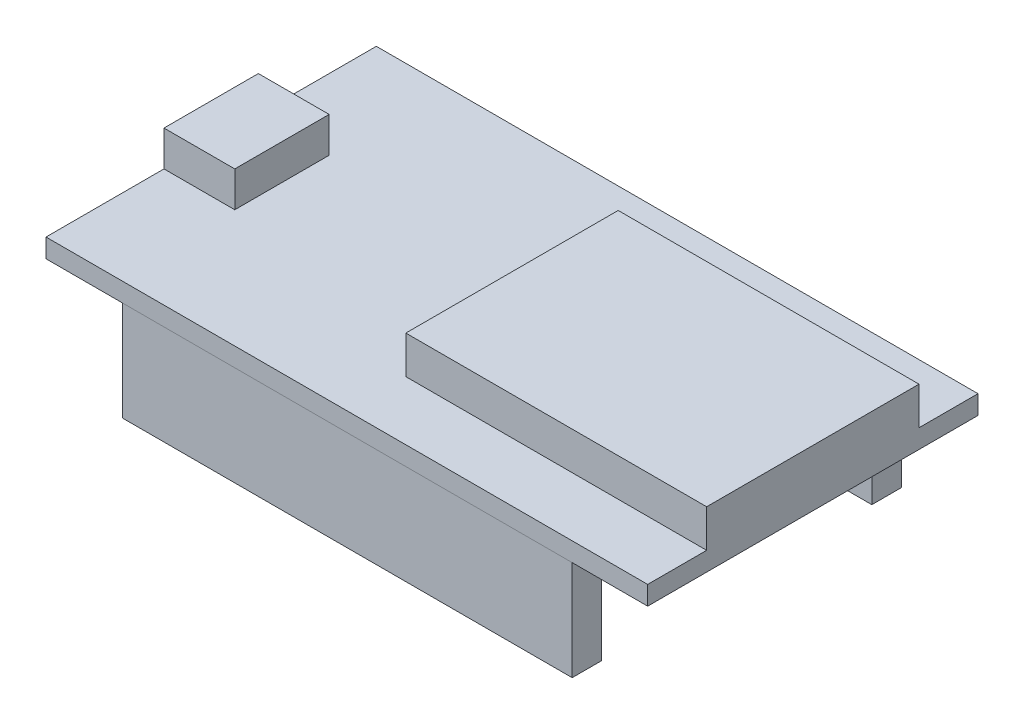
ISO-10303-21;
HEADER;
FILE_DESCRIPTION(('STEP AP214'),'2;1');
FILE_NAME('part.step','',(''),(''),'','','');
FILE_SCHEMA(('AUTOMOTIVE_DESIGN { 1 0 10303 214 1 1 1 1 }'));
ENDSEC;
DATA;
#1=APPLICATION_CONTEXT('core data for automotive mechanical design processes');
#2=APPLICATION_PROTOCOL_DEFINITION('international standard','automotive_design',2000,#1);
#3=PRODUCT_CONTEXT('',#1,'mechanical');
#4=PRODUCT('Part','Part','',(#3));
#5=PRODUCT_RELATED_PRODUCT_CATEGORY('part','',(#4));
#6=PRODUCT_DEFINITION_FORMATION('','',#4);
#7=PRODUCT_DEFINITION_CONTEXT('part definition',#1,'design');
#8=PRODUCT_DEFINITION('design','',#6,#7);
#9=PRODUCT_DEFINITION_SHAPE('','',#8);
#10=(LENGTH_UNIT() NAMED_UNIT(*) SI_UNIT(.MILLI.,.METRE.));
#11=(NAMED_UNIT(*) PLANE_ANGLE_UNIT() SI_UNIT($,.RADIAN.));
#12=(NAMED_UNIT(*) SI_UNIT($,.STERADIAN.) SOLID_ANGLE_UNIT());
#13=UNCERTAINTY_MEASURE_WITH_UNIT(LENGTH_MEASURE(1.E-05),#10,'distance_accuracy_value','');
#14=(GEOMETRIC_REPRESENTATION_CONTEXT(3) GLOBAL_UNCERTAINTY_ASSIGNED_CONTEXT((#13)) GLOBAL_UNIT_ASSIGNED_CONTEXT((#10,
#11,#12)) REPRESENTATION_CONTEXT('',''));
#15=CARTESIAN_POINT('',(0.,0.,0.));
#16=DIRECTION('',(0.,0.,1.));
#17=DIRECTION('',(1.,0.,0.));
#18=AXIS2_PLACEMENT_3D('',#15,#16,#17);
#19=CARTESIAN_POINT('',(0.,0.,0.));
#20=DIRECTION('',(0.,-1.,0.));
#21=DIRECTION('',(0.,0.,-1.));
#22=AXIS2_PLACEMENT_3D('',#19,#20,#21);
#23=PLANE('',#22);
#24=DIRECTION('',(0.,0.,-1.));
#25=VECTOR('',#24,1.);
#26=CARTESIAN_POINT('',(25.5,0.,14.));
#27=LINE('',#26,#25);
#28=CARTESIAN_POINT('',(25.5,0.,14.));
#29=VERTEX_POINT('',#28);
#30=CARTESIAN_POINT('',(25.5,0.,-14.));
#31=VERTEX_POINT('',#30);
#32=EDGE_CURVE('E312',#29,#31,#27,.T.);
#33=ORIENTED_EDGE('',*,*,#32,.F.);
#34=DIRECTION('',(1.,0.,0.));
#35=VECTOR('',#34,1.);
#36=CARTESIAN_POINT('',(-25.5,0.,14.));
#37=LINE('',#36,#35);
#38=CARTESIAN_POINT('',(-25.5,0.,14.));
#39=VERTEX_POINT('',#38);
#40=EDGE_CURVE('E331',#39,#29,#37,.T.);
#41=ORIENTED_EDGE('',*,*,#40,.F.);
#42=DIRECTION('',(0.,0.,1.));
#43=VECTOR('',#42,1.);
#44=CARTESIAN_POINT('',(-25.5,0.,14.));
#45=LINE('',#44,#43);
#46=CARTESIAN_POINT('',(-25.5,0.,-14.));
#47=VERTEX_POINT('',#46);
#48=EDGE_CURVE('E327',#47,#39,#45,.T.);
#49=ORIENTED_EDGE('',*,*,#48,.F.);
#50=DIRECTION('',(-1.,0.,0.));
#51=VECTOR('',#50,1.);
#52=CARTESIAN_POINT('',(-25.5,0.,-14.));
#53=LINE('',#52,#51);
#54=EDGE_CURVE('E330',#31,#47,#53,.T.);
#55=ORIENTED_EDGE('',*,*,#54,.F.);
#56=EDGE_LOOP('',(#33,#41,#49,#55));
#57=FACE_BOUND('',#56,.T.);
#58=DIRECTION('',(-1.,0.,0.));
#59=VECTOR('',#58,1.);
#60=CARTESIAN_POINT('',(19.05,0.,-13.95));
#61=LINE('',#60,#59);
#62=CARTESIAN_POINT('',(19.05,0.,-13.95));
#63=VERTEX_POINT('',#62);
#64=CARTESIAN_POINT('',(-19.05,0.,-13.95));
#65=VERTEX_POINT('',#64);
#66=EDGE_CURVE('E235',#63,#65,#61,.T.);
#67=ORIENTED_EDGE('',*,*,#66,.T.);
#68=DIRECTION('',(0.,0.,1.));
#69=VECTOR('',#68,1.);
#70=CARTESIAN_POINT('',(-19.05,0.,-13.95));
#71=LINE('',#70,#69);
#72=CARTESIAN_POINT('',(-19.05,0.,-11.45));
#73=VERTEX_POINT('',#72);
#74=EDGE_CURVE('E69',#65,#73,#71,.T.);
#75=ORIENTED_EDGE('',*,*,#74,.T.);
#76=DIRECTION('',(1.,0.,0.));
#77=VECTOR('',#76,1.);
#78=CARTESIAN_POINT('',(-19.05,0.,-11.45));
#79=LINE('',#78,#77);
#80=CARTESIAN_POINT('',(19.05,0.,-11.45));
#81=VERTEX_POINT('',#80);
#82=EDGE_CURVE('E224',#73,#81,#79,.T.);
#83=ORIENTED_EDGE('',*,*,#82,.T.);
#84=DIRECTION('',(0.,0.,-1.));
#85=VECTOR('',#84,1.);
#86=CARTESIAN_POINT('',(19.05,0.,-11.45));
#87=LINE('',#86,#85);
#88=EDGE_CURVE('E230',#81,#63,#87,.T.);
#89=ORIENTED_EDGE('',*,*,#88,.T.);
#90=EDGE_LOOP('',(#67,#75,#83,#89));
#91=FACE_BOUND('',#90,.T.);
#92=DIRECTION('',(-1.,0.,0.));
#93=VECTOR('',#92,1.);
#94=CARTESIAN_POINT('',(19.05,0.,11.45));
#95=LINE('',#94,#93);
#96=CARTESIAN_POINT('',(19.05,0.,11.45));
#97=VERTEX_POINT('',#96);
#98=CARTESIAN_POINT('',(-19.05,0.,11.45));
#99=VERTEX_POINT('',#98);
#100=EDGE_CURVE('E207',#97,#99,#95,.T.);
#101=ORIENTED_EDGE('',*,*,#100,.T.);
#102=DIRECTION('',(0.,0.,1.));
#103=VECTOR('',#102,1.);
#104=CARTESIAN_POINT('',(-19.05,0.,11.45));
#105=LINE('',#104,#103);
#106=CARTESIAN_POINT('',(-19.05,0.,13.95));
#107=VERTEX_POINT('',#106);
#108=EDGE_CURVE('E65',#99,#107,#105,.T.);
#109=ORIENTED_EDGE('',*,*,#108,.T.);
#110=DIRECTION('',(1.,0.,0.));
#111=VECTOR('',#110,1.);
#112=CARTESIAN_POINT('',(-19.05,0.,13.95));
#113=LINE('',#112,#111);
#114=CARTESIAN_POINT('',(19.05,0.,13.95));
#115=VERTEX_POINT('',#114);
#116=EDGE_CURVE('E189',#107,#115,#113,.T.);
#117=ORIENTED_EDGE('',*,*,#116,.T.);
#118=DIRECTION('',(0.,0.,-1.));
#119=VECTOR('',#118,1.);
#120=CARTESIAN_POINT('',(19.05,0.,13.95));
#121=LINE('',#120,#119);
#122=EDGE_CURVE('E200',#115,#97,#121,.T.);
#123=ORIENTED_EDGE('',*,*,#122,.T.);
#124=EDGE_LOOP('',(#101,#109,#117,#123));
#125=FACE_BOUND('',#124,.T.);
#126=ADVANCED_FACE('F50',(#57,#91,#125),#23,.T.);
#127=CARTESIAN_POINT('',(0.,1.6,0.));
#128=DIRECTION('',(0.,-1.,0.));
#129=DIRECTION('',(0.,0.,-1.));
#130=AXIS2_PLACEMENT_3D('',#127,#128,#129);
#131=PLANE('',#130);
#132=DIRECTION('',(-1.,0.,0.));
#133=VECTOR('',#132,1.);
#134=CARTESIAN_POINT('',(-19.5,1.6,-4.));
#135=LINE('',#134,#133);
#136=CARTESIAN_POINT('',(-19.5,1.6,-4.));
#137=VERTEX_POINT('',#136);
#138=CARTESIAN_POINT('',(-25.5,1.6,-4.));
#139=VERTEX_POINT('',#138);
#140=EDGE_CURVE('E259',#137,#139,#135,.T.);
#141=ORIENTED_EDGE('',*,*,#140,.F.);
#142=DIRECTION('',(0.,0.,-1.));
#143=VECTOR('',#142,1.);
#144=CARTESIAN_POINT('',(-19.5,1.6,4.));
#145=LINE('',#144,#143);
#146=CARTESIAN_POINT('',(-19.5,1.6,4.));
#147=VERTEX_POINT('',#146);
#148=EDGE_CURVE('E270',#147,#137,#145,.T.);
#149=ORIENTED_EDGE('',*,*,#148,.F.);
#150=DIRECTION('',(1.,0.,0.));
#151=VECTOR('',#150,1.);
#152=CARTESIAN_POINT('',(-25.5,1.6,4.));
#153=LINE('',#152,#151);
#154=CARTESIAN_POINT('',(-25.5,1.6,4.));
#155=VERTEX_POINT('',#154);
#156=EDGE_CURVE('E254',#155,#147,#153,.T.);
#157=ORIENTED_EDGE('',*,*,#156,.F.);
#158=DIRECTION('',(0.,0.,1.));
#159=VECTOR('',#158,1.);
#160=CARTESIAN_POINT('',(-25.5,1.6,14.));
#161=LINE('',#160,#159);
#162=CARTESIAN_POINT('',(-25.5,1.6,14.));
#163=VERTEX_POINT('',#162);
#164=EDGE_CURVE('E316',#155,#163,#161,.T.);
#165=ORIENTED_EDGE('',*,*,#164,.T.);
#166=DIRECTION('',(1.,0.,0.));
#167=VECTOR('',#166,1.);
#168=CARTESIAN_POINT('',(-25.5,1.6,14.));
#169=LINE('',#168,#167);
#170=CARTESIAN_POINT('',(25.5,1.6,14.));
#171=VERTEX_POINT('',#170);
#172=EDGE_CURVE('E325',#163,#171,#169,.T.);
#173=ORIENTED_EDGE('',*,*,#172,.T.);
#174=DIRECTION('',(0.,0.,-1.));
#175=VECTOR('',#174,1.);
#176=CARTESIAN_POINT('',(25.5,1.6,14.));
#177=LINE('',#176,#175);
#178=CARTESIAN_POINT('',(25.5,1.6,9.));
#179=VERTEX_POINT('',#178);
#180=EDGE_CURVE('E313',#171,#179,#177,.T.);
#181=ORIENTED_EDGE('',*,*,#180,.T.);
#182=DIRECTION('',(1.,0.,0.));
#183=VECTOR('',#182,1.);
#184=CARTESIAN_POINT('',(0.,1.6,9.));
#185=LINE('',#184,#183);
#186=CARTESIAN_POINT('',(0.,1.6,9.));
#187=VERTEX_POINT('',#186);
#188=EDGE_CURVE('E300',#187,#179,#185,.T.);
#189=ORIENTED_EDGE('',*,*,#188,.F.);
#190=DIRECTION('',(0.,0.,1.));
#191=VECTOR('',#190,1.);
#192=CARTESIAN_POINT('',(0.,1.6,-9.));
#193=LINE('',#192,#191);
#194=CARTESIAN_POINT('',(0.,1.6,-9.));
#195=VERTEX_POINT('',#194);
#196=EDGE_CURVE('E283',#195,#187,#193,.T.);
#197=ORIENTED_EDGE('',*,*,#196,.F.);
#198=DIRECTION('',(-1.,0.,0.));
#199=VECTOR('',#198,1.);
#200=CARTESIAN_POINT('',(25.5,1.6,-9.));
#201=LINE('',#200,#199);
#202=CARTESIAN_POINT('',(25.5,1.6,-9.));
#203=VERTEX_POINT('',#202);
#204=EDGE_CURVE('E287',#203,#195,#201,.T.);
#205=ORIENTED_EDGE('',*,*,#204,.F.);
#206=CARTESIAN_POINT('',(25.5,1.6,-14.));
#207=VERTEX_POINT('',#206);
#208=EDGE_CURVE('E320',#203,#207,#177,.T.);
#209=ORIENTED_EDGE('',*,*,#208,.T.);
#210=DIRECTION('',(-1.,0.,0.));
#211=VECTOR('',#210,1.);
#212=CARTESIAN_POINT('',(-25.5,1.6,-14.));
#213=LINE('',#212,#211);
#214=CARTESIAN_POINT('',(-25.5,1.6,-14.));
#215=VERTEX_POINT('',#214);
#216=EDGE_CURVE('E317',#207,#215,#213,.T.);
#217=ORIENTED_EDGE('',*,*,#216,.T.);
#218=EDGE_CURVE('E318',#215,#139,#161,.T.);
#219=ORIENTED_EDGE('',*,*,#218,.T.);
#220=EDGE_LOOP('',(#141,#149,#157,#165,#173,#181,#189,#197,#205,#209,#217,#219));
#221=FACE_BOUND('',#220,.T.);
#222=ADVANCED_FACE('F359',(#221),#131,.F.);
#223=CARTESIAN_POINT('',(25.5,1.6,14.));
#224=DIRECTION('',(-1.,0.,0.));
#225=DIRECTION('',(0.,0.,1.));
#226=AXIS2_PLACEMENT_3D('',#223,#224,#225);
#227=PLANE('',#226);
#228=ORIENTED_EDGE('',*,*,#32,.T.);
#229=DIRECTION('',(0.,-1.,0.));
#230=VECTOR('',#229,1.);
#231=CARTESIAN_POINT('',(25.5,1.6,-14.));
#232=LINE('',#231,#230);
#233=EDGE_CURVE('E11',#207,#31,#232,.T.);
#234=ORIENTED_EDGE('',*,*,#233,.F.);
#235=ORIENTED_EDGE('',*,*,#208,.F.);
#236=DIRECTION('',(0.,-1.,0.));
#237=VECTOR('',#236,1.);
#238=CARTESIAN_POINT('',(25.5,4.8,-9.));
#239=LINE('',#238,#237);
#240=CARTESIAN_POINT('',(25.5,4.8,-9.));
#241=VERTEX_POINT('',#240);
#242=EDGE_CURVE('E302',#241,#203,#239,.T.);
#243=ORIENTED_EDGE('',*,*,#242,.F.);
#244=DIRECTION('',(0.,0.,-1.));
#245=VECTOR('',#244,1.);
#246=CARTESIAN_POINT('',(25.5,4.8,9.));
#247=LINE('',#246,#245);
#248=CARTESIAN_POINT('',(25.5,4.8,9.));
#249=VERTEX_POINT('',#248);
#250=EDGE_CURVE('E289',#249,#241,#247,.T.);
#251=ORIENTED_EDGE('',*,*,#250,.F.);
#252=DIRECTION('',(0.,-1.,0.));
#253=VECTOR('',#252,1.);
#254=CARTESIAN_POINT('',(25.5,4.8,9.));
#255=LINE('',#254,#253);
#256=EDGE_CURVE('E310',#249,#179,#255,.T.);
#257=ORIENTED_EDGE('',*,*,#256,.T.);
#258=ORIENTED_EDGE('',*,*,#180,.F.);
#259=DIRECTION('',(0.,-1.,0.));
#260=VECTOR('',#259,1.);
#261=CARTESIAN_POINT('',(25.5,1.6,14.));
#262=LINE('',#261,#260);
#263=EDGE_CURVE('E321',#171,#29,#262,.T.);
#264=ORIENTED_EDGE('',*,*,#263,.T.);
#265=EDGE_LOOP('',(#228,#234,#235,#243,#251,#257,#258,#264));
#266=FACE_BOUND('',#265,.T.);
#267=ADVANCED_FACE('F47',(#266),#227,.F.);
#268=CARTESIAN_POINT('',(-25.5,1.6,-14.));
#269=DIRECTION('',(0.,0.,1.));
#270=DIRECTION('',(1.,0.,0.));
#271=AXIS2_PLACEMENT_3D('',#268,#269,#270);
#272=PLANE('',#271);
#273=ORIENTED_EDGE('',*,*,#54,.T.);
#274=DIRECTION('',(0.,-1.,0.));
#275=VECTOR('',#274,1.);
#276=CARTESIAN_POINT('',(-25.5,1.6,-14.));
#277=LINE('',#276,#275);
#278=EDGE_CURVE('E54',#215,#47,#277,.T.);
#279=ORIENTED_EDGE('',*,*,#278,.F.);
#280=ORIENTED_EDGE('',*,*,#216,.F.);
#281=ORIENTED_EDGE('',*,*,#233,.T.);
#282=EDGE_LOOP('',(#273,#279,#280,#281));
#283=FACE_BOUND('',#282,.T.);
#284=ADVANCED_FACE('F373',(#283),#272,.F.);
#285=CARTESIAN_POINT('',(-25.5,1.6,14.));
#286=DIRECTION('',(1.,0.,0.));
#287=DIRECTION('',(0.,0.,-1.));
#288=AXIS2_PLACEMENT_3D('',#285,#286,#287);
#289=PLANE('',#288);
#290=ORIENTED_EDGE('',*,*,#48,.T.);
#291=DIRECTION('',(0.,-1.,0.));
#292=VECTOR('',#291,1.);
#293=CARTESIAN_POINT('',(-25.5,1.6,14.));
#294=LINE('',#293,#292);
#295=EDGE_CURVE('E334',#163,#39,#294,.T.);
#296=ORIENTED_EDGE('',*,*,#295,.F.);
#297=ORIENTED_EDGE('',*,*,#164,.F.);
#298=DIRECTION('',(0.,-1.,0.));
#299=VECTOR('',#298,1.);
#300=CARTESIAN_POINT('',(-25.5,4.6,4.));
#301=LINE('',#300,#299);
#302=CARTESIAN_POINT('',(-25.5,4.6,4.));
#303=VERTEX_POINT('',#302);
#304=EDGE_CURVE('E278',#303,#155,#301,.T.);
#305=ORIENTED_EDGE('',*,*,#304,.F.);
#306=DIRECTION('',(0.,0.,1.));
#307=VECTOR('',#306,1.);
#308=CARTESIAN_POINT('',(-25.5,4.6,-4.));
#309=LINE('',#308,#307);
#310=CARTESIAN_POINT('',(-25.5,4.6,-4.));
#311=VERTEX_POINT('',#310);
#312=EDGE_CURVE('E251',#311,#303,#309,.T.);
#313=ORIENTED_EDGE('',*,*,#312,.F.);
#314=DIRECTION('',(0.,-1.,0.));
#315=VECTOR('',#314,1.);
#316=CARTESIAN_POINT('',(-25.5,4.6,-4.));
#317=LINE('',#316,#315);
#318=EDGE_CURVE('E262',#311,#139,#317,.T.);
#319=ORIENTED_EDGE('',*,*,#318,.T.);
#320=ORIENTED_EDGE('',*,*,#218,.F.);
#321=ORIENTED_EDGE('',*,*,#278,.T.);
#322=EDGE_LOOP('',(#290,#296,#297,#305,#313,#319,#320,#321));
#323=FACE_BOUND('',#322,.T.);
#324=ADVANCED_FACE('F345',(#323),#289,.F.);
#325=CARTESIAN_POINT('',(-25.5,1.6,14.));
#326=DIRECTION('',(0.,0.,-1.));
#327=DIRECTION('',(-1.,0.,0.));
#328=AXIS2_PLACEMENT_3D('',#325,#326,#327);
#329=PLANE('',#328);
#330=ORIENTED_EDGE('',*,*,#40,.T.);
#331=ORIENTED_EDGE('',*,*,#263,.F.);
#332=ORIENTED_EDGE('',*,*,#172,.F.);
#333=ORIENTED_EDGE('',*,*,#295,.T.);
#334=EDGE_LOOP('',(#330,#331,#332,#333));
#335=FACE_BOUND('',#334,.T.);
#336=ADVANCED_FACE('F355',(#335),#329,.F.);
#337=CARTESIAN_POINT('',(0.,4.8,-9.));
#338=DIRECTION('',(1.,0.,0.));
#339=DIRECTION('',(0.,0.,-1.));
#340=AXIS2_PLACEMENT_3D('',#337,#338,#339);
#341=PLANE('',#340);
#342=ORIENTED_EDGE('',*,*,#196,.T.);
#343=DIRECTION('',(0.,-1.,0.));
#344=VECTOR('',#343,1.);
#345=CARTESIAN_POINT('',(0.,4.8,9.));
#346=LINE('',#345,#344);
#347=CARTESIAN_POINT('',(0.,4.8,9.));
#348=VERTEX_POINT('',#347);
#349=EDGE_CURVE('E309',#348,#187,#346,.T.);
#350=ORIENTED_EDGE('',*,*,#349,.F.);
#351=DIRECTION('',(0.,0.,1.));
#352=VECTOR('',#351,1.);
#353=CARTESIAN_POINT('',(0.,4.8,-9.));
#354=LINE('',#353,#352);
#355=CARTESIAN_POINT('',(0.,4.8,-9.));
#356=VERTEX_POINT('',#355);
#357=EDGE_CURVE('E282',#356,#348,#354,.T.);
#358=ORIENTED_EDGE('',*,*,#357,.F.);
#359=DIRECTION('',(0.,-1.,0.));
#360=VECTOR('',#359,1.);
#361=CARTESIAN_POINT('',(0.,4.8,-9.));
#362=LINE('',#361,#360);
#363=EDGE_CURVE('E295',#356,#195,#362,.T.);
#364=ORIENTED_EDGE('',*,*,#363,.T.);
#365=EDGE_LOOP('',(#342,#350,#358,#364));
#366=FACE_BOUND('',#365,.T.);
#367=ADVANCED_FACE('F366',(#366),#341,.F.);
#368=CARTESIAN_POINT('',(0.,4.8,9.));
#369=DIRECTION('',(0.,0.,-1.));
#370=DIRECTION('',(-1.,0.,0.));
#371=AXIS2_PLACEMENT_3D('',#368,#369,#370);
#372=PLANE('',#371);
#373=ORIENTED_EDGE('',*,*,#188,.T.);
#374=ORIENTED_EDGE('',*,*,#256,.F.);
#375=DIRECTION('',(1.,0.,0.));
#376=VECTOR('',#375,1.);
#377=CARTESIAN_POINT('',(0.,4.8,9.));
#378=LINE('',#377,#376);
#379=EDGE_CURVE('E290',#348,#249,#378,.T.);
#380=ORIENTED_EDGE('',*,*,#379,.F.);
#381=ORIENTED_EDGE('',*,*,#349,.T.);
#382=EDGE_LOOP('',(#373,#374,#380,#381));
#383=FACE_BOUND('',#382,.T.);
#384=ADVANCED_FACE('F365',(#383),#372,.F.);
#385=CARTESIAN_POINT('',(25.5,4.8,-9.));
#386=DIRECTION('',(0.,0.,1.));
#387=DIRECTION('',(1.,0.,0.));
#388=AXIS2_PLACEMENT_3D('',#385,#386,#387);
#389=PLANE('',#388);
#390=ORIENTED_EDGE('',*,*,#204,.T.);
#391=ORIENTED_EDGE('',*,*,#363,.F.);
#392=DIRECTION('',(-1.,0.,0.));
#393=VECTOR('',#392,1.);
#394=CARTESIAN_POINT('',(25.5,4.8,-9.));
#395=LINE('',#394,#393);
#396=EDGE_CURVE('E292',#241,#356,#395,.T.);
#397=ORIENTED_EDGE('',*,*,#396,.F.);
#398=ORIENTED_EDGE('',*,*,#242,.T.);
#399=EDGE_LOOP('',(#390,#391,#397,#398));
#400=FACE_BOUND('',#399,.T.);
#401=ADVANCED_FACE('F369',(#400),#389,.F.);
#402=CARTESIAN_POINT('',(0.,4.8,0.));
#403=DIRECTION('',(0.,1.,0.));
#404=DIRECTION('',(0.,0.,1.));
#405=AXIS2_PLACEMENT_3D('',#402,#403,#404);
#406=PLANE('',#405);
#407=ORIENTED_EDGE('',*,*,#357,.T.);
#408=ORIENTED_EDGE('',*,*,#379,.T.);
#409=ORIENTED_EDGE('',*,*,#250,.T.);
#410=ORIENTED_EDGE('',*,*,#396,.T.);
#411=EDGE_LOOP('',(#407,#408,#409,#410));
#412=FACE_BOUND('',#411,.T.);
#413=ADVANCED_FACE('F402',(#412),#406,.T.);
#414=CARTESIAN_POINT('',(-25.5,4.6,4.));
#415=DIRECTION('',(0.,0.,-1.));
#416=DIRECTION('',(-1.,0.,0.));
#417=AXIS2_PLACEMENT_3D('',#414,#415,#416);
#418=PLANE('',#417);
#419=ORIENTED_EDGE('',*,*,#156,.T.);
#420=DIRECTION('',(0.,-1.,0.));
#421=VECTOR('',#420,1.);
#422=CARTESIAN_POINT('',(-19.5,4.6,4.));
#423=LINE('',#422,#421);
#424=CARTESIAN_POINT('',(-19.5,4.6,4.));
#425=VERTEX_POINT('',#424);
#426=EDGE_CURVE('E280',#425,#147,#423,.T.);
#427=ORIENTED_EDGE('',*,*,#426,.F.);
#428=DIRECTION('',(1.,0.,0.));
#429=VECTOR('',#428,1.);
#430=CARTESIAN_POINT('',(-25.5,4.6,4.));
#431=LINE('',#430,#429);
#432=EDGE_CURVE('E260',#303,#425,#431,.T.);
#433=ORIENTED_EDGE('',*,*,#432,.F.);
#434=ORIENTED_EDGE('',*,*,#304,.T.);
#435=EDGE_LOOP('',(#419,#427,#433,#434));
#436=FACE_BOUND('',#435,.T.);
#437=ADVANCED_FACE('F404',(#436),#418,.F.);
#438=CARTESIAN_POINT('',(-19.5,4.6,4.));
#439=DIRECTION('',(-1.,0.,0.));
#440=DIRECTION('',(0.,0.,1.));
#441=AXIS2_PLACEMENT_3D('',#438,#439,#440);
#442=PLANE('',#441);
#443=ORIENTED_EDGE('',*,*,#148,.T.);
#444=DIRECTION('',(0.,-1.,0.));
#445=VECTOR('',#444,1.);
#446=CARTESIAN_POINT('',(-19.5,4.6,-4.));
#447=LINE('',#446,#445);
#448=CARTESIAN_POINT('',(-19.5,4.6,-4.));
#449=VERTEX_POINT('',#448);
#450=EDGE_CURVE('E274',#449,#137,#447,.T.);
#451=ORIENTED_EDGE('',*,*,#450,.F.);
#452=DIRECTION('',(0.,0.,-1.));
#453=VECTOR('',#452,1.);
#454=CARTESIAN_POINT('',(-19.5,4.6,4.));
#455=LINE('',#454,#453);
#456=EDGE_CURVE('E258',#425,#449,#455,.T.);
#457=ORIENTED_EDGE('',*,*,#456,.F.);
#458=ORIENTED_EDGE('',*,*,#426,.T.);
#459=EDGE_LOOP('',(#443,#451,#457,#458));
#460=FACE_BOUND('',#459,.T.);
#461=ADVANCED_FACE('F409',(#460),#442,.F.);
#462=CARTESIAN_POINT('',(-19.5,4.6,-4.));
#463=DIRECTION('',(0.,0.,1.));
#464=DIRECTION('',(1.,0.,0.));
#465=AXIS2_PLACEMENT_3D('',#462,#463,#464);
#466=PLANE('',#465);
#467=ORIENTED_EDGE('',*,*,#140,.T.);
#468=ORIENTED_EDGE('',*,*,#318,.F.);
#469=DIRECTION('',(-1.,0.,0.));
#470=VECTOR('',#469,1.);
#471=CARTESIAN_POINT('',(-19.5,4.6,-4.));
#472=LINE('',#471,#470);
#473=EDGE_CURVE('E265',#449,#311,#472,.T.);
#474=ORIENTED_EDGE('',*,*,#473,.F.);
#475=ORIENTED_EDGE('',*,*,#450,.T.);
#476=EDGE_LOOP('',(#467,#468,#474,#475));
#477=FACE_BOUND('',#476,.T.);
#478=ADVANCED_FACE('F415',(#477),#466,.F.);
#479=CARTESIAN_POINT('',(0.,4.6,0.));
#480=DIRECTION('',(0.,1.,0.));
#481=DIRECTION('',(0.,0.,1.));
#482=AXIS2_PLACEMENT_3D('',#479,#480,#481);
#483=PLANE('',#482);
#484=ORIENTED_EDGE('',*,*,#312,.T.);
#485=ORIENTED_EDGE('',*,*,#432,.T.);
#486=ORIENTED_EDGE('',*,*,#456,.T.);
#487=ORIENTED_EDGE('',*,*,#473,.T.);
#488=EDGE_LOOP('',(#484,#485,#486,#487));
#489=FACE_BOUND('',#488,.T.);
#490=ADVANCED_FACE('F416',(#489),#483,.T.);
#491=CARTESIAN_POINT('',(-19.05,0.,-13.95));
#492=DIRECTION('',(1.,0.,0.));
#493=DIRECTION('',(0.,0.,-1.));
#494=AXIS2_PLACEMENT_3D('',#491,#492,#493);
#495=PLANE('',#494);
#496=DIRECTION('',(0.,0.,1.));
#497=VECTOR('',#496,1.);
#498=CARTESIAN_POINT('',(-19.05,-8.5,-13.95));
#499=LINE('',#498,#497);
#500=CARTESIAN_POINT('',(-19.05,-8.5,-13.95));
#501=VERTEX_POINT('',#500);
#502=CARTESIAN_POINT('',(-19.05,-8.5,-11.45));
#503=VERTEX_POINT('',#502);
#504=EDGE_CURVE('E205',#501,#503,#499,.T.);
#505=ORIENTED_EDGE('',*,*,#504,.T.);
#506=DIRECTION('',(0.,-1.,0.));
#507=VECTOR('',#506,1.);
#508=CARTESIAN_POINT('',(-19.05,0.,-11.45));
#509=LINE('',#508,#507);
#510=EDGE_CURVE('E249',#73,#503,#509,.T.);
#511=ORIENTED_EDGE('',*,*,#510,.F.);
#512=ORIENTED_EDGE('',*,*,#74,.F.);
#513=DIRECTION('',(0.,-1.,0.));
#514=VECTOR('',#513,1.);
#515=CARTESIAN_POINT('',(-19.05,0.,-13.95));
#516=LINE('',#515,#514);
#517=EDGE_CURVE('E232',#65,#501,#516,.T.);
#518=ORIENTED_EDGE('',*,*,#517,.T.);
#519=EDGE_LOOP('',(#505,#511,#512,#518));
#520=FACE_BOUND('',#519,.T.);
#521=ADVANCED_FACE('F419',(#520),#495,.F.);
#522=CARTESIAN_POINT('',(-19.05,0.,-11.45));
#523=DIRECTION('',(0.,0.,-1.));
#524=DIRECTION('',(-1.,0.,0.));
#525=AXIS2_PLACEMENT_3D('',#522,#523,#524);
#526=PLANE('',#525);
#527=DIRECTION('',(1.,0.,0.));
#528=VECTOR('',#527,1.);
#529=CARTESIAN_POINT('',(-19.05,-8.5,-11.45));
#530=LINE('',#529,#528);
#531=CARTESIAN_POINT('',(19.05,-8.5,-11.45));
#532=VERTEX_POINT('',#531);
#533=EDGE_CURVE('E238',#503,#532,#530,.T.);
#534=ORIENTED_EDGE('',*,*,#533,.T.);
#535=DIRECTION('',(0.,-1.,0.));
#536=VECTOR('',#535,1.);
#537=CARTESIAN_POINT('',(19.05,0.,-11.45));
#538=LINE('',#537,#536);
#539=EDGE_CURVE('E250',#81,#532,#538,.T.);
#540=ORIENTED_EDGE('',*,*,#539,.F.);
#541=ORIENTED_EDGE('',*,*,#82,.F.);
#542=ORIENTED_EDGE('',*,*,#510,.T.);
#543=EDGE_LOOP('',(#534,#540,#541,#542));
#544=FACE_BOUND('',#543,.T.);
#545=ADVANCED_FACE('F425',(#544),#526,.F.);
#546=CARTESIAN_POINT('',(19.05,0.,-11.45));
#547=DIRECTION('',(-1.,0.,0.));
#548=DIRECTION('',(0.,0.,1.));
#549=AXIS2_PLACEMENT_3D('',#546,#547,#548);
#550=PLANE('',#549);
#551=DIRECTION('',(0.,0.,-1.));
#552=VECTOR('',#551,1.);
#553=CARTESIAN_POINT('',(19.05,-8.5,-11.45));
#554=LINE('',#553,#552);
#555=CARTESIAN_POINT('',(19.05,-8.5,-13.95));
#556=VERTEX_POINT('',#555);
#557=EDGE_CURVE('E239',#532,#556,#554,.T.);
#558=ORIENTED_EDGE('',*,*,#557,.T.);
#559=DIRECTION('',(0.,-1.,0.));
#560=VECTOR('',#559,1.);
#561=CARTESIAN_POINT('',(19.05,0.,-13.95));
#562=LINE('',#561,#560);
#563=EDGE_CURVE('E242',#63,#556,#562,.T.);
#564=ORIENTED_EDGE('',*,*,#563,.F.);
#565=ORIENTED_EDGE('',*,*,#88,.F.);
#566=ORIENTED_EDGE('',*,*,#539,.T.);
#567=EDGE_LOOP('',(#558,#564,#565,#566));
#568=FACE_BOUND('',#567,.T.);
#569=ADVANCED_FACE('F430',(#568),#550,.F.);
#570=CARTESIAN_POINT('',(19.05,0.,-13.95));
#571=DIRECTION('',(0.,0.,1.));
#572=DIRECTION('',(1.,0.,0.));
#573=AXIS2_PLACEMENT_3D('',#570,#571,#572);
#574=PLANE('',#573);
#575=DIRECTION('',(-1.,0.,0.));
#576=VECTOR('',#575,1.);
#577=CARTESIAN_POINT('',(19.05,-8.5,-13.95));
#578=LINE('',#577,#576);
#579=EDGE_CURVE('E228',#556,#501,#578,.T.);
#580=ORIENTED_EDGE('',*,*,#579,.T.);
#581=ORIENTED_EDGE('',*,*,#517,.F.);
#582=ORIENTED_EDGE('',*,*,#66,.F.);
#583=ORIENTED_EDGE('',*,*,#563,.T.);
#584=EDGE_LOOP('',(#580,#581,#582,#583));
#585=FACE_BOUND('',#584,.T.);
#586=ADVANCED_FACE('F431',(#585),#574,.F.);
#587=CARTESIAN_POINT('',(0.,-8.5,0.));
#588=DIRECTION('',(0.,1.,0.));
#589=DIRECTION('',(0.,0.,1.));
#590=AXIS2_PLACEMENT_3D('',#587,#588,#589);
#591=PLANE('',#590);
#592=ORIENTED_EDGE('',*,*,#504,.F.);
#593=ORIENTED_EDGE('',*,*,#579,.F.);
#594=ORIENTED_EDGE('',*,*,#557,.F.);
#595=ORIENTED_EDGE('',*,*,#533,.F.);
#596=EDGE_LOOP('',(#592,#593,#594,#595));
#597=FACE_BOUND('',#596,.T.);
#598=ADVANCED_FACE('F434',(#597),#591,.F.);
#599=CARTESIAN_POINT('',(-19.05,0.,11.45));
#600=DIRECTION('',(1.,0.,0.));
#601=DIRECTION('',(0.,0.,-1.));
#602=AXIS2_PLACEMENT_3D('',#599,#600,#601);
#603=PLANE('',#602);
#604=DIRECTION('',(0.,0.,1.));
#605=VECTOR('',#604,1.);
#606=CARTESIAN_POINT('',(-19.05,-8.5,11.45));
#607=LINE('',#606,#605);
#608=CARTESIAN_POINT('',(-19.05,-8.5,11.45));
#609=VERTEX_POINT('',#608);
#610=CARTESIAN_POINT('',(-19.05,-8.5,13.95));
#611=VERTEX_POINT('',#610);
#612=EDGE_CURVE('E201',#609,#611,#607,.T.);
#613=ORIENTED_EDGE('',*,*,#612,.T.);
#614=DIRECTION('',(0.,-1.,0.));
#615=VECTOR('',#614,1.);
#616=CARTESIAN_POINT('',(-19.05,0.,13.95));
#617=LINE('',#616,#615);
#618=EDGE_CURVE('E188',#107,#611,#617,.T.);
#619=ORIENTED_EDGE('',*,*,#618,.F.);
#620=ORIENTED_EDGE('',*,*,#108,.F.);
#621=DIRECTION('',(0.,-1.,0.));
#622=VECTOR('',#621,1.);
#623=CARTESIAN_POINT('',(-19.05,0.,11.45));
#624=LINE('',#623,#622);
#625=EDGE_CURVE('E211',#99,#609,#624,.T.);
#626=ORIENTED_EDGE('',*,*,#625,.T.);
#627=EDGE_LOOP('',(#613,#619,#620,#626));
#628=FACE_BOUND('',#627,.T.);
#629=ADVANCED_FACE('F197',(#628),#603,.F.);
#630=CARTESIAN_POINT('',(-19.05,0.,13.95));
#631=DIRECTION('',(0.,0.,-1.));
#632=DIRECTION('',(-1.,0.,0.));
#633=AXIS2_PLACEMENT_3D('',#630,#631,#632);
#634=PLANE('',#633);
#635=DIRECTION('',(1.,0.,0.));
#636=VECTOR('',#635,1.);
#637=CARTESIAN_POINT('',(-19.05,-8.5,13.95));
#638=LINE('',#637,#636);
#639=CARTESIAN_POINT('',(19.05,-8.5,13.95));
#640=VERTEX_POINT('',#639);
#641=EDGE_CURVE('E216',#611,#640,#638,.T.);
#642=ORIENTED_EDGE('',*,*,#641,.T.);
#643=DIRECTION('',(0.,-1.,0.));
#644=VECTOR('',#643,1.);
#645=CARTESIAN_POINT('',(19.05,0.,13.95));
#646=LINE('',#645,#644);
#647=EDGE_CURVE('E194',#115,#640,#646,.T.);
#648=ORIENTED_EDGE('',*,*,#647,.F.);
#649=ORIENTED_EDGE('',*,*,#116,.F.);
#650=ORIENTED_EDGE('',*,*,#618,.T.);
#651=EDGE_LOOP('',(#642,#648,#649,#650));
#652=FACE_BOUND('',#651,.T.);
#653=ADVANCED_FACE('F186',(#652),#634,.F.);
#654=CARTESIAN_POINT('',(19.05,0.,13.95));
#655=DIRECTION('',(-1.,0.,0.));
#656=DIRECTION('',(0.,0.,1.));
#657=AXIS2_PLACEMENT_3D('',#654,#655,#656);
#658=PLANE('',#657);
#659=DIRECTION('',(0.,0.,-1.));
#660=VECTOR('',#659,1.);
#661=CARTESIAN_POINT('',(19.05,-8.5,13.95));
#662=LINE('',#661,#660);
#663=CARTESIAN_POINT('',(19.05,-8.5,11.45));
#664=VERTEX_POINT('',#663);
#665=EDGE_CURVE('E209',#640,#664,#662,.T.);
#666=ORIENTED_EDGE('',*,*,#665,.T.);
#667=DIRECTION('',(0.,-1.,0.));
#668=VECTOR('',#667,1.);
#669=CARTESIAN_POINT('',(19.05,0.,11.45));
#670=LINE('',#669,#668);
#671=EDGE_CURVE('E219',#97,#664,#670,.T.);
#672=ORIENTED_EDGE('',*,*,#671,.F.);
#673=ORIENTED_EDGE('',*,*,#122,.F.);
#674=ORIENTED_EDGE('',*,*,#647,.T.);
#675=EDGE_LOOP('',(#666,#672,#673,#674));
#676=FACE_BOUND('',#675,.T.);
#677=ADVANCED_FACE('F443',(#676),#658,.F.);
#678=CARTESIAN_POINT('',(19.05,0.,11.45));
#679=DIRECTION('',(0.,0.,1.));
#680=DIRECTION('',(1.,0.,0.));
#681=AXIS2_PLACEMENT_3D('',#678,#679,#680);
#682=PLANE('',#681);
#683=DIRECTION('',(-1.,0.,0.));
#684=VECTOR('',#683,1.);
#685=CARTESIAN_POINT('',(19.05,-8.5,11.45));
#686=LINE('',#685,#684);
#687=EDGE_CURVE('E210',#664,#609,#686,.T.);
#688=ORIENTED_EDGE('',*,*,#687,.T.);
#689=ORIENTED_EDGE('',*,*,#625,.F.);
#690=ORIENTED_EDGE('',*,*,#100,.F.);
#691=ORIENTED_EDGE('',*,*,#671,.T.);
#692=EDGE_LOOP('',(#688,#689,#690,#691));
#693=FACE_BOUND('',#692,.T.);
#694=ADVANCED_FACE('F450',(#693),#682,.F.);
#695=CARTESIAN_POINT('',(0.,-8.5,0.));
#696=DIRECTION('',(0.,1.,0.));
#697=DIRECTION('',(0.,0.,1.));
#698=AXIS2_PLACEMENT_3D('',#695,#696,#697);
#699=PLANE('',#698);
#700=ORIENTED_EDGE('',*,*,#612,.F.);
#701=ORIENTED_EDGE('',*,*,#687,.F.);
#702=ORIENTED_EDGE('',*,*,#665,.F.);
#703=ORIENTED_EDGE('',*,*,#641,.F.);
#704=EDGE_LOOP('',(#700,#701,#702,#703));
#705=FACE_BOUND('',#704,.T.);
#706=ADVANCED_FACE('F452',(#705),#699,.F.);
#707=CLOSED_SHELL('',(#126,#222,#267,#284,#324,#336,#367,#384,#401,#413,#437,#461,#478,#490,
#521,#545,#569,#586,#598,#629,#653,#677,#694,#706));
#708=MANIFOLD_SOLID_BREP('B2',#707);
#709=ADVANCED_BREP_SHAPE_REPRESENTATION('',(#18,#708),#14);
#710=SHAPE_DEFINITION_REPRESENTATION(#9,#709);
ENDSEC;
END-ISO-10303-21;
